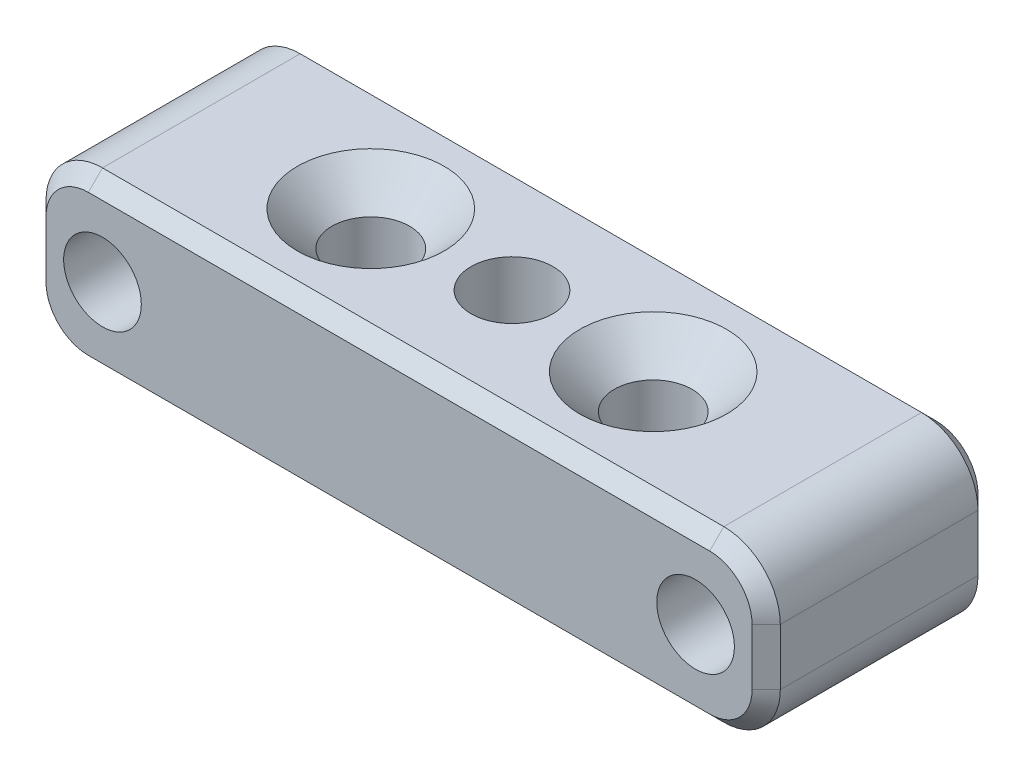
ISO-10303-21;
HEADER;
FILE_DESCRIPTION(('STEP AP214'),'2;1');
FILE_NAME('part.step','',(''),(''),'','','');
FILE_SCHEMA(('AUTOMOTIVE_DESIGN { 1 0 10303 214 1 1 1 1 }'));
ENDSEC;
DATA;
#1=APPLICATION_CONTEXT('core data for automotive mechanical design processes');
#2=APPLICATION_PROTOCOL_DEFINITION('international standard','automotive_design',2000,#1);
#3=PRODUCT_CONTEXT('',#1,'mechanical');
#4=PRODUCT('Part','Part','',(#3));
#5=PRODUCT_RELATED_PRODUCT_CATEGORY('part','',(#4));
#6=PRODUCT_DEFINITION_FORMATION('','',#4);
#7=PRODUCT_DEFINITION_CONTEXT('part definition',#1,'design');
#8=PRODUCT_DEFINITION('design','',#6,#7);
#9=PRODUCT_DEFINITION_SHAPE('','',#8);
#10=(LENGTH_UNIT() NAMED_UNIT(*) SI_UNIT(.MILLI.,.METRE.));
#11=(NAMED_UNIT(*) PLANE_ANGLE_UNIT() SI_UNIT($,.RADIAN.));
#12=(NAMED_UNIT(*) SI_UNIT($,.STERADIAN.) SOLID_ANGLE_UNIT());
#13=UNCERTAINTY_MEASURE_WITH_UNIT(LENGTH_MEASURE(1.E-05),#10,'distance_accuracy_value','');
#14=(GEOMETRIC_REPRESENTATION_CONTEXT(3) GLOBAL_UNCERTAINTY_ASSIGNED_CONTEXT((#13)) GLOBAL_UNIT_ASSIGNED_CONTEXT((#10,
#11,#12)) REPRESENTATION_CONTEXT('',''));
#15=CARTESIAN_POINT('',(0.,0.,0.));
#16=DIRECTION('',(0.,0.,1.));
#17=DIRECTION('',(1.,0.,0.));
#18=AXIS2_PLACEMENT_3D('',#15,#16,#17);
#19=CARTESIAN_POINT('',(0.,-12.,0.));
#20=DIRECTION('',(0.,-1.,0.));
#21=DIRECTION('',(0.,0.,-1.));
#22=AXIS2_PLACEMENT_3D('',#19,#20,#21);
#23=PLANE('',#22);
#24=CARTESIAN_POINT('',(-10.,-12.,24.));
#25=DIRECTION('',(0.,1.,0.));
#26=DIRECTION('',(0.,0.,1.));
#27=AXIS2_PLACEMENT_3D('',#24,#25,#26);
#28=CIRCLE('',#27,5.2);
#29=CARTESIAN_POINT('',(-10.,-12.,29.2));
#30=VERTEX_POINT('',#29);
#31=EDGE_CURVE('E455',#30,#30,#28,.T.);
#32=ORIENTED_EDGE('',*,*,#31,.F.);
#33=EDGE_LOOP('',(#32));
#34=FACE_BOUND('',#33,.T.);
#35=CARTESIAN_POINT('',(10.,-12.,24.));
#36=DIRECTION('',(0.,1.,0.));
#37=DIRECTION('',(0.,0.,1.));
#38=AXIS2_PLACEMENT_3D('',#35,#36,#37);
#39=CIRCLE('',#38,5.2);
#40=CARTESIAN_POINT('',(10.,-12.,29.2));
#41=VERTEX_POINT('',#40);
#42=EDGE_CURVE('E462',#41,#41,#39,.T.);
#43=ORIENTED_EDGE('',*,*,#42,.F.);
#44=EDGE_LOOP('',(#43));
#45=FACE_BOUND('',#44,.T.);
#46=DIRECTION('',(0.,0.,1.));
#47=VECTOR('',#46,1.);
#48=CARTESIAN_POINT('',(22.,-12.,16.));
#49=LINE('',#48,#47);
#50=CARTESIAN_POINT('',(22.,-12.,31.));
#51=VERTEX_POINT('',#50);
#52=CARTESIAN_POINT('',(22.,-12.,17.));
#53=VERTEX_POINT('',#52);
#54=EDGE_CURVE('E202',#51,#53,#49,.F.);
#55=ORIENTED_EDGE('',*,*,#54,.T.);
#56=DIRECTION('',(-1.,0.,0.));
#57=VECTOR('',#56,1.);
#58=CARTESIAN_POINT('',(-22.,-12.,17.));
#59=LINE('',#58,#57);
#60=CARTESIAN_POINT('',(-22.,-12.,17.));
#61=VERTEX_POINT('',#60);
#62=EDGE_CURVE('E253',#53,#61,#59,.T.);
#63=ORIENTED_EDGE('',*,*,#62,.T.);
#64=DIRECTION('',(0.,0.,-1.));
#65=VECTOR('',#64,1.);
#66=CARTESIAN_POINT('',(-22.,-12.,32.));
#67=LINE('',#66,#65);
#68=CARTESIAN_POINT('',(-22.,-12.,31.));
#69=VERTEX_POINT('',#68);
#70=EDGE_CURVE('E205',#61,#69,#67,.F.);
#71=ORIENTED_EDGE('',*,*,#70,.T.);
#72=DIRECTION('',(1.,0.,0.));
#73=VECTOR('',#72,1.);
#74=CARTESIAN_POINT('',(22.,-12.,31.));
#75=LINE('',#74,#73);
#76=EDGE_CURVE('E251',#69,#51,#75,.T.);
#77=ORIENTED_EDGE('',*,*,#76,.T.);
#78=EDGE_LOOP('',(#55,#63,#71,#77));
#79=FACE_BOUND('',#78,.T.);
#80=CARTESIAN_POINT('',(0.,-12.,24.));
#81=DIRECTION('',(0.,1.,0.));
#82=DIRECTION('',(0.,0.,1.));
#83=AXIS2_PLACEMENT_3D('',#80,#81,#82);
#84=CIRCLE('',#83,2.9);
#85=CARTESIAN_POINT('',(0.,-12.,26.9));
#86=VERTEX_POINT('',#85);
#87=EDGE_CURVE('E197',#86,#86,#84,.T.);
#88=ORIENTED_EDGE('',*,*,#87,.F.);
#89=EDGE_LOOP('',(#88));
#90=FACE_BOUND('',#89,.T.);
#91=ADVANCED_FACE('F43',(#34,#45,#79,#90),#23,.F.);
#92=CARTESIAN_POINT('',(0.,-24.,0.));
#93=DIRECTION('',(0.,-1.,0.));
#94=DIRECTION('',(0.,0.,-1.));
#95=AXIS2_PLACEMENT_3D('',#92,#93,#94);
#96=PLANE('',#95);
#97=CARTESIAN_POINT('',(-10.,-24.,24.));
#98=DIRECTION('',(0.,-1.,0.));
#99=DIRECTION('',(0.,0.,-1.));
#100=AXIS2_PLACEMENT_3D('',#97,#98,#99);
#101=CIRCLE('',#100,2.74999999999999);
#102=CARTESIAN_POINT('',(-10.,-24.,21.25));
#103=VERTEX_POINT('',#102);
#104=EDGE_CURVE('E461',#103,#103,#101,.T.);
#105=ORIENTED_EDGE('',*,*,#104,.F.);
#106=EDGE_LOOP('',(#105));
#107=FACE_BOUND('',#106,.T.);
#108=CARTESIAN_POINT('',(10.,-24.,24.));
#109=DIRECTION('',(0.,-1.,0.));
#110=DIRECTION('',(0.,0.,-1.));
#111=AXIS2_PLACEMENT_3D('',#108,#109,#110);
#112=CIRCLE('',#111,2.74999999999999);
#113=CARTESIAN_POINT('',(10.,-24.,21.25));
#114=VERTEX_POINT('',#113);
#115=EDGE_CURVE('E468',#114,#114,#112,.T.);
#116=ORIENTED_EDGE('',*,*,#115,.F.);
#117=EDGE_LOOP('',(#116));
#118=FACE_BOUND('',#117,.T.);
#119=DIRECTION('',(0.,0.,-1.));
#120=VECTOR('',#119,1.);
#121=CARTESIAN_POINT('',(-22.,-24.,0.));
#122=LINE('',#121,#120);
#123=CARTESIAN_POINT('',(-22.,-24.,31.));
#124=VERTEX_POINT('',#123);
#125=CARTESIAN_POINT('',(-22.,-24.,17.));
#126=VERTEX_POINT('',#125);
#127=EDGE_CURVE('E183',#124,#126,#122,.T.);
#128=ORIENTED_EDGE('',*,*,#127,.T.);
#129=DIRECTION('',(1.,0.,0.));
#130=VECTOR('',#129,1.);
#131=CARTESIAN_POINT('',(0.,-24.,17.));
#132=LINE('',#131,#130);
#133=CARTESIAN_POINT('',(22.,-24.,17.));
#134=VERTEX_POINT('',#133);
#135=EDGE_CURVE('E187',#126,#134,#132,.T.);
#136=ORIENTED_EDGE('',*,*,#135,.T.);
#137=DIRECTION('',(0.,0.,1.));
#138=VECTOR('',#137,1.);
#139=CARTESIAN_POINT('',(22.,-24.,0.));
#140=LINE('',#139,#138);
#141=CARTESIAN_POINT('',(22.,-24.,31.));
#142=VERTEX_POINT('',#141);
#143=EDGE_CURVE('E186',#134,#142,#140,.T.);
#144=ORIENTED_EDGE('',*,*,#143,.T.);
#145=DIRECTION('',(-1.,0.,0.));
#146=VECTOR('',#145,1.);
#147=CARTESIAN_POINT('',(0.,-24.,31.));
#148=LINE('',#147,#146);
#149=EDGE_CURVE('E162',#142,#124,#148,.T.);
#150=ORIENTED_EDGE('',*,*,#149,.T.);
#151=EDGE_LOOP('',(#128,#136,#144,#150));
#152=FACE_BOUND('',#151,.T.);
#153=CARTESIAN_POINT('',(0.,-24.,24.));
#154=DIRECTION('',(0.,1.,0.));
#155=DIRECTION('',(0.,0.,1.));
#156=AXIS2_PLACEMENT_3D('',#153,#154,#155);
#157=CIRCLE('',#156,2.9);
#158=CARTESIAN_POINT('',(0.,-24.,26.9));
#159=VERTEX_POINT('',#158);
#160=EDGE_CURVE('E471',#159,#159,#157,.T.);
#161=ORIENTED_EDGE('',*,*,#160,.T.);
#162=EDGE_LOOP('',(#161));
#163=FACE_BOUND('',#162,.T.);
#164=ADVANCED_FACE('F180',(#107,#118,#152,#163),#96,.T.);
#165=CARTESIAN_POINT('',(-26.,-12.,16.));
#166=DIRECTION('',(0.,0.,-1.));
#167=DIRECTION('',(-1.,0.,0.));
#168=AXIS2_PLACEMENT_3D('',#165,#166,#167);
#169=PLANE('',#168);
#170=CARTESIAN_POINT('',(22.,-20.,16.));
#171=DIRECTION('',(0.,0.,-1.));
#172=DIRECTION('',(-1.,0.,0.));
#173=AXIS2_PLACEMENT_3D('',#170,#171,#172);
#174=CIRCLE('',#173,3.00000000000001);
#175=CARTESIAN_POINT('',(25.,-20.,16.));
#176=VERTEX_POINT('',#175);
#177=CARTESIAN_POINT('',(22.,-23.,16.));
#178=VERTEX_POINT('',#177);
#179=EDGE_CURVE('E224',#176,#178,#174,.T.);
#180=ORIENTED_EDGE('',*,*,#179,.T.);
#181=DIRECTION('',(-1.,0.,0.));
#182=VECTOR('',#181,1.);
#183=CARTESIAN_POINT('',(-26.,-23.,16.));
#184=LINE('',#183,#182);
#185=CARTESIAN_POINT('',(-22.,-23.,16.));
#186=VERTEX_POINT('',#185);
#187=EDGE_CURVE('E175',#178,#186,#184,.T.);
#188=ORIENTED_EDGE('',*,*,#187,.T.);
#189=CARTESIAN_POINT('',(-22.,-20.,16.));
#190=DIRECTION('',(0.,0.,-1.));
#191=DIRECTION('',(-1.,0.,0.));
#192=AXIS2_PLACEMENT_3D('',#189,#190,#191);
#193=CIRCLE('',#192,3.00000000000001);
#194=CARTESIAN_POINT('',(-25.,-20.,16.));
#195=VERTEX_POINT('',#194);
#196=EDGE_CURVE('E226',#186,#195,#193,.T.);
#197=ORIENTED_EDGE('',*,*,#196,.T.);
#198=DIRECTION('',(0.,1.,0.));
#199=VECTOR('',#198,1.);
#200=CARTESIAN_POINT('',(-25.,-12.,16.));
#201=LINE('',#200,#199);
#202=CARTESIAN_POINT('',(-25.,-16.,16.));
#203=VERTEX_POINT('',#202);
#204=EDGE_CURVE('E222',#195,#203,#201,.T.);
#205=ORIENTED_EDGE('',*,*,#204,.T.);
#206=CARTESIAN_POINT('',(-22.,-16.,16.));
#207=DIRECTION('',(0.,0.,-1.));
#208=DIRECTION('',(-1.,0.,0.));
#209=AXIS2_PLACEMENT_3D('',#206,#207,#208);
#210=CIRCLE('',#209,3.00000000000001);
#211=CARTESIAN_POINT('',(-22.,-13.,16.));
#212=VERTEX_POINT('',#211);
#213=EDGE_CURVE('E218',#203,#212,#210,.T.);
#214=ORIENTED_EDGE('',*,*,#213,.T.);
#215=DIRECTION('',(1.,0.,0.));
#216=VECTOR('',#215,1.);
#217=CARTESIAN_POINT('',(22.,-13.,16.));
#218=LINE('',#217,#216);
#219=CARTESIAN_POINT('',(22.,-13.,16.));
#220=VERTEX_POINT('',#219);
#221=EDGE_CURVE('E214',#212,#220,#218,.T.);
#222=ORIENTED_EDGE('',*,*,#221,.T.);
#223=CARTESIAN_POINT('',(22.,-16.,16.));
#224=DIRECTION('',(0.,0.,-1.));
#225=DIRECTION('',(-1.,0.,0.));
#226=AXIS2_PLACEMENT_3D('',#223,#224,#225);
#227=CIRCLE('',#226,3.00000000000001);
#228=CARTESIAN_POINT('',(25.,-16.,16.));
#229=VERTEX_POINT('',#228);
#230=EDGE_CURVE('E216',#220,#229,#227,.T.);
#231=ORIENTED_EDGE('',*,*,#230,.T.);
#232=DIRECTION('',(0.,-1.,0.));
#233=VECTOR('',#232,1.);
#234=CARTESIAN_POINT('',(25.,-12.,16.));
#235=LINE('',#234,#233);
#236=EDGE_CURVE('E220',#229,#176,#235,.T.);
#237=ORIENTED_EDGE('',*,*,#236,.T.);
#238=EDGE_LOOP('',(#180,#188,#197,#205,#214,#222,#231,#237));
#239=FACE_BOUND('',#238,.T.);
#240=CARTESIAN_POINT('',(21.,-18.,16.));
#241=DIRECTION('',(0.,0.,-1.));
#242=DIRECTION('',(-1.,0.,0.));
#243=AXIS2_PLACEMENT_3D('',#240,#241,#242);
#244=CIRCLE('',#243,2.74999999999996);
#245=CARTESIAN_POINT('',(18.25,-18.,16.));
#246=VERTEX_POINT('',#245);
#247=EDGE_CURVE('E443',#246,#246,#244,.T.);
#248=ORIENTED_EDGE('',*,*,#247,.F.);
#249=EDGE_LOOP('',(#248));
#250=FACE_BOUND('',#249,.T.);
#251=CARTESIAN_POINT('',(-21.,-18.,16.));
#252=DIRECTION('',(0.,0.,-1.));
#253=DIRECTION('',(-1.,0.,0.));
#254=AXIS2_PLACEMENT_3D('',#251,#252,#253);
#255=CIRCLE('',#254,2.74999999999996);
#256=CARTESIAN_POINT('',(-23.75,-18.,16.));
#257=VERTEX_POINT('',#256);
#258=EDGE_CURVE('E452',#257,#257,#255,.T.);
#259=ORIENTED_EDGE('',*,*,#258,.F.);
#260=EDGE_LOOP('',(#259));
#261=FACE_BOUND('',#260,.T.);
#262=ADVANCED_FACE('F346',(#239,#250,#261),#169,.T.);
#263=CARTESIAN_POINT('',(-26.,-12.,32.));
#264=DIRECTION('',(-1.,0.,0.));
#265=DIRECTION('',(0.,0.,1.));
#266=AXIS2_PLACEMENT_3D('',#263,#264,#265);
#267=PLANE('',#266);
#268=DIRECTION('',(0.,0.,-1.));
#269=VECTOR('',#268,1.);
#270=CARTESIAN_POINT('',(-26.,-16.,16.));
#271=LINE('',#270,#269);
#272=CARTESIAN_POINT('',(-26.,-16.,31.));
#273=VERTEX_POINT('',#272);
#274=CARTESIAN_POINT('',(-26.,-16.,17.));
#275=VERTEX_POINT('',#274);
#276=EDGE_CURVE('E192',#273,#275,#271,.T.);
#277=ORIENTED_EDGE('',*,*,#276,.T.);
#278=DIRECTION('',(0.,-1.,0.));
#279=VECTOR('',#278,1.);
#280=CARTESIAN_POINT('',(-26.,-12.,17.));
#281=LINE('',#280,#279);
#282=CARTESIAN_POINT('',(-26.,-20.,17.));
#283=VERTEX_POINT('',#282);
#284=EDGE_CURVE('E237',#275,#283,#281,.T.);
#285=ORIENTED_EDGE('',*,*,#284,.T.);
#286=DIRECTION('',(0.,0.,-1.));
#287=VECTOR('',#286,1.);
#288=CARTESIAN_POINT('',(-26.,-20.,32.));
#289=LINE('',#288,#287);
#290=CARTESIAN_POINT('',(-26.,-20.,31.));
#291=VERTEX_POINT('',#290);
#292=EDGE_CURVE('E195',#283,#291,#289,.F.);
#293=ORIENTED_EDGE('',*,*,#292,.T.);
#294=DIRECTION('',(0.,1.,0.));
#295=VECTOR('',#294,1.);
#296=CARTESIAN_POINT('',(-26.,-12.,31.));
#297=LINE('',#296,#295);
#298=EDGE_CURVE('E235',#291,#273,#297,.T.);
#299=ORIENTED_EDGE('',*,*,#298,.T.);
#300=EDGE_LOOP('',(#277,#285,#293,#299));
#301=FACE_BOUND('',#300,.T.);
#302=ADVANCED_FACE('F389',(#301),#267,.T.);
#303=CARTESIAN_POINT('',(26.,-12.,32.));
#304=DIRECTION('',(0.,0.,1.));
#305=DIRECTION('',(1.,0.,0.));
#306=AXIS2_PLACEMENT_3D('',#303,#304,#305);
#307=PLANE('',#306);
#308=CARTESIAN_POINT('',(-22.,-20.,32.));
#309=DIRECTION('',(0.,0.,1.));
#310=DIRECTION('',(1.,0.,0.));
#311=AXIS2_PLACEMENT_3D('',#308,#309,#310);
#312=CIRCLE('',#311,3.00000000000001);
#313=CARTESIAN_POINT('',(-25.,-20.,32.));
#314=VERTEX_POINT('',#313);
#315=CARTESIAN_POINT('',(-22.,-23.,32.));
#316=VERTEX_POINT('',#315);
#317=EDGE_CURVE('E68',#314,#316,#312,.T.);
#318=ORIENTED_EDGE('',*,*,#317,.T.);
#319=DIRECTION('',(1.,0.,0.));
#320=VECTOR('',#319,1.);
#321=CARTESIAN_POINT('',(26.,-23.,32.));
#322=LINE('',#321,#320);
#323=CARTESIAN_POINT('',(22.,-23.,32.));
#324=VERTEX_POINT('',#323);
#325=EDGE_CURVE('E11',#316,#324,#322,.T.);
#326=ORIENTED_EDGE('',*,*,#325,.T.);
#327=CARTESIAN_POINT('',(22.,-20.,32.));
#328=DIRECTION('',(0.,0.,1.));
#329=DIRECTION('',(1.,0.,0.));
#330=AXIS2_PLACEMENT_3D('',#327,#328,#329);
#331=CIRCLE('',#330,3.00000000000001);
#332=CARTESIAN_POINT('',(25.,-20.,32.));
#333=VERTEX_POINT('',#332);
#334=EDGE_CURVE('E53',#324,#333,#331,.T.);
#335=ORIENTED_EDGE('',*,*,#334,.T.);
#336=DIRECTION('',(0.,1.,0.));
#337=VECTOR('',#336,1.);
#338=CARTESIAN_POINT('',(25.,-12.,32.));
#339=LINE('',#338,#337);
#340=CARTESIAN_POINT('',(25.,-16.,32.));
#341=VERTEX_POINT('',#340);
#342=EDGE_CURVE('E263',#333,#341,#339,.T.);
#343=ORIENTED_EDGE('',*,*,#342,.T.);
#344=CARTESIAN_POINT('',(22.,-16.,32.));
#345=DIRECTION('',(0.,0.,1.));
#346=DIRECTION('',(1.,0.,0.));
#347=AXIS2_PLACEMENT_3D('',#344,#345,#346);
#348=CIRCLE('',#347,3.00000000000001);
#349=CARTESIAN_POINT('',(22.,-13.,32.));
#350=VERTEX_POINT('',#349);
#351=EDGE_CURVE('E259',#341,#350,#348,.T.);
#352=ORIENTED_EDGE('',*,*,#351,.T.);
#353=DIRECTION('',(-1.,0.,0.));
#354=VECTOR('',#353,1.);
#355=CARTESIAN_POINT('',(-22.,-13.,32.));
#356=LINE('',#355,#354);
#357=CARTESIAN_POINT('',(-22.,-13.,32.));
#358=VERTEX_POINT('',#357);
#359=EDGE_CURVE('E255',#350,#358,#356,.T.);
#360=ORIENTED_EDGE('',*,*,#359,.T.);
#361=CARTESIAN_POINT('',(-22.,-16.,32.));
#362=DIRECTION('',(0.,0.,1.));
#363=DIRECTION('',(1.,0.,0.));
#364=AXIS2_PLACEMENT_3D('',#361,#362,#363);
#365=CIRCLE('',#364,3.00000000000001);
#366=CARTESIAN_POINT('',(-25.,-16.,32.));
#367=VERTEX_POINT('',#366);
#368=EDGE_CURVE('E257',#358,#367,#365,.T.);
#369=ORIENTED_EDGE('',*,*,#368,.T.);
#370=DIRECTION('',(0.,-1.,0.));
#371=VECTOR('',#370,1.);
#372=CARTESIAN_POINT('',(-25.,-12.,32.));
#373=LINE('',#372,#371);
#374=EDGE_CURVE('E261',#367,#314,#373,.T.);
#375=ORIENTED_EDGE('',*,*,#374,.T.);
#376=EDGE_LOOP('',(#318,#326,#335,#343,#352,#360,#369,#375));
#377=FACE_BOUND('',#376,.T.);
#378=CARTESIAN_POINT('',(21.,-18.,32.));
#379=DIRECTION('',(0.,0.,1.));
#380=DIRECTION('',(1.,0.,0.));
#381=AXIS2_PLACEMENT_3D('',#378,#379,#380);
#382=CIRCLE('',#381,2.75);
#383=CARTESIAN_POINT('',(23.75,-18.,32.));
#384=VERTEX_POINT('',#383);
#385=EDGE_CURVE('E288',#384,#384,#382,.T.);
#386=ORIENTED_EDGE('',*,*,#385,.F.);
#387=EDGE_LOOP('',(#386));
#388=FACE_BOUND('',#387,.T.);
#389=CARTESIAN_POINT('',(-21.,-18.,32.));
#390=DIRECTION('',(0.,0.,1.));
#391=DIRECTION('',(1.,0.,0.));
#392=AXIS2_PLACEMENT_3D('',#389,#390,#391);
#393=CIRCLE('',#392,2.75);
#394=CARTESIAN_POINT('',(-18.25,-18.,32.));
#395=VERTEX_POINT('',#394);
#396=EDGE_CURVE('E447',#395,#395,#393,.T.);
#397=ORIENTED_EDGE('',*,*,#396,.F.);
#398=EDGE_LOOP('',(#397));
#399=FACE_BOUND('',#398,.T.);
#400=ADVANCED_FACE('F316',(#377,#388,#399),#307,.T.);
#401=CARTESIAN_POINT('',(26.,-12.,16.));
#402=DIRECTION('',(1.,0.,0.));
#403=DIRECTION('',(0.,0.,-1.));
#404=AXIS2_PLACEMENT_3D('',#401,#402,#403);
#405=PLANE('',#404);
#406=DIRECTION('',(0.,0.,1.));
#407=VECTOR('',#406,1.);
#408=CARTESIAN_POINT('',(26.,-20.,16.));
#409=LINE('',#408,#407);
#410=CARTESIAN_POINT('',(26.,-20.,31.));
#411=VERTEX_POINT('',#410);
#412=CARTESIAN_POINT('',(26.,-20.,17.));
#413=VERTEX_POINT('',#412);
#414=EDGE_CURVE('E188',#411,#413,#409,.F.);
#415=ORIENTED_EDGE('',*,*,#414,.T.);
#416=DIRECTION('',(0.,1.,0.));
#417=VECTOR('',#416,1.);
#418=CARTESIAN_POINT('',(26.,-12.,17.));
#419=LINE('',#418,#417);
#420=CARTESIAN_POINT('',(26.,-16.,17.));
#421=VERTEX_POINT('',#420);
#422=EDGE_CURVE('E241',#413,#421,#419,.T.);
#423=ORIENTED_EDGE('',*,*,#422,.T.);
#424=DIRECTION('',(0.,0.,1.));
#425=VECTOR('',#424,1.);
#426=CARTESIAN_POINT('',(26.,-16.,32.));
#427=LINE('',#426,#425);
#428=CARTESIAN_POINT('',(26.,-16.,31.));
#429=VERTEX_POINT('',#428);
#430=EDGE_CURVE('E208',#421,#429,#427,.T.);
#431=ORIENTED_EDGE('',*,*,#430,.T.);
#432=DIRECTION('',(0.,-1.,0.));
#433=VECTOR('',#432,1.);
#434=CARTESIAN_POINT('',(26.,-12.,31.));
#435=LINE('',#434,#433);
#436=EDGE_CURVE('E239',#429,#411,#435,.T.);
#437=ORIENTED_EDGE('',*,*,#436,.T.);
#438=EDGE_LOOP('',(#415,#423,#431,#437));
#439=FACE_BOUND('',#438,.T.);
#440=ADVANCED_FACE('F333',(#439),#405,.T.);
#441=CARTESIAN_POINT('',(0.,-12.,24.));
#442=DIRECTION('',(0.,-1.,0.));
#443=DIRECTION('',(0.,0.,-1.));
#444=AXIS2_PLACEMENT_3D('',#441,#442,#443);
#445=CYLINDRICAL_SURFACE('',#444,2.9);
#446=ORIENTED_EDGE('',*,*,#87,.T.);
#447=EDGE_LOOP('',(#446));
#448=FACE_BOUND('',#447,.T.);
#449=ORIENTED_EDGE('',*,*,#160,.F.);
#450=EDGE_LOOP('',(#449));
#451=FACE_BOUND('',#450,.T.);
#452=ADVANCED_FACE('F409',(#448,#451),#445,.F.);
#453=CARTESIAN_POINT('',(10.,-12.,24.));
#454=DIRECTION('',(0.,1.,0.));
#455=DIRECTION('',(0.,0.,1.));
#456=AXIS2_PLACEMENT_3D('',#453,#454,#455);
#457=CYLINDRICAL_SURFACE('',#456,2.74999999999999);
#458=ORIENTED_EDGE('',*,*,#115,.T.);
#459=EDGE_LOOP('',(#458));
#460=FACE_BOUND('',#459,.T.);
#461=CARTESIAN_POINT('',(10.,-14.45,24.));
#462=DIRECTION('',(0.,1.,0.));
#463=DIRECTION('',(0.,0.,1.));
#464=AXIS2_PLACEMENT_3D('',#461,#462,#463);
#465=CIRCLE('',#464,2.75);
#466=CARTESIAN_POINT('',(10.,-14.45,26.75));
#467=VERTEX_POINT('',#466);
#468=EDGE_CURVE('E465',#467,#467,#465,.T.);
#469=ORIENTED_EDGE('',*,*,#468,.T.);
#470=EDGE_LOOP('',(#469));
#471=FACE_BOUND('',#470,.T.);
#472=ADVANCED_FACE('F412',(#460,#471),#457,.F.);
#473=CARTESIAN_POINT('',(10.,-12.,24.));
#474=DIRECTION('',(0.,1.,0.));
#475=DIRECTION('',(0.,0.,1.));
#476=AXIS2_PLACEMENT_3D('',#473,#474,#475);
#477=CONICAL_SURFACE('',#476,5.2,0.785398163397449);
#478=ORIENTED_EDGE('',*,*,#468,.F.);
#479=EDGE_LOOP('',(#478));
#480=FACE_BOUND('',#479,.T.);
#481=ORIENTED_EDGE('',*,*,#42,.T.);
#482=EDGE_LOOP('',(#481));
#483=FACE_BOUND('',#482,.T.);
#484=ADVANCED_FACE('F416',(#480,#483),#477,.F.);
#485=CARTESIAN_POINT('',(-10.,-12.,24.));
#486=DIRECTION('',(0.,1.,0.));
#487=DIRECTION('',(0.,0.,1.));
#488=AXIS2_PLACEMENT_3D('',#485,#486,#487);
#489=CYLINDRICAL_SURFACE('',#488,2.74999999999999);
#490=ORIENTED_EDGE('',*,*,#104,.T.);
#491=EDGE_LOOP('',(#490));
#492=FACE_BOUND('',#491,.T.);
#493=CARTESIAN_POINT('',(-10.,-14.45,24.));
#494=DIRECTION('',(0.,1.,0.));
#495=DIRECTION('',(0.,0.,1.));
#496=AXIS2_PLACEMENT_3D('',#493,#494,#495);
#497=CIRCLE('',#496,2.75);
#498=CARTESIAN_POINT('',(-10.,-14.45,26.75));
#499=VERTEX_POINT('',#498);
#500=EDGE_CURVE('E458',#499,#499,#497,.T.);
#501=ORIENTED_EDGE('',*,*,#500,.T.);
#502=EDGE_LOOP('',(#501));
#503=FACE_BOUND('',#502,.T.);
#504=ADVANCED_FACE('F420',(#492,#503),#489,.F.);
#505=CARTESIAN_POINT('',(-10.,-12.,24.));
#506=DIRECTION('',(0.,1.,0.));
#507=DIRECTION('',(0.,0.,1.));
#508=AXIS2_PLACEMENT_3D('',#505,#506,#507);
#509=CONICAL_SURFACE('',#508,5.2,0.785398163397449);
#510=ORIENTED_EDGE('',*,*,#500,.F.);
#511=EDGE_LOOP('',(#510));
#512=FACE_BOUND('',#511,.T.);
#513=ORIENTED_EDGE('',*,*,#31,.T.);
#514=EDGE_LOOP('',(#513));
#515=FACE_BOUND('',#514,.T.);
#516=ADVANCED_FACE('F424',(#512,#515),#509,.F.);
#517=CARTESIAN_POINT('',(-21.,-18.,32.));
#518=DIRECTION('',(0.,0.,1.));
#519=DIRECTION('',(1.,0.,0.));
#520=AXIS2_PLACEMENT_3D('',#517,#518,#519);
#521=CYLINDRICAL_SURFACE('',#520,2.74999999999996);
#522=ORIENTED_EDGE('',*,*,#258,.T.);
#523=EDGE_LOOP('',(#522));
#524=FACE_BOUND('',#523,.T.);
#525=ORIENTED_EDGE('',*,*,#396,.T.);
#526=EDGE_LOOP('',(#525));
#527=FACE_BOUND('',#526,.T.);
#528=ADVANCED_FACE('F428',(#524,#527),#521,.F.);
#529=CARTESIAN_POINT('',(21.,-18.,32.));
#530=DIRECTION('',(0.,0.,1.));
#531=DIRECTION('',(1.,0.,0.));
#532=AXIS2_PLACEMENT_3D('',#529,#530,#531);
#533=CYLINDRICAL_SURFACE('',#532,2.74999999999996);
#534=ORIENTED_EDGE('',*,*,#247,.T.);
#535=EDGE_LOOP('',(#534));
#536=FACE_BOUND('',#535,.T.);
#537=ORIENTED_EDGE('',*,*,#385,.T.);
#538=EDGE_LOOP('',(#537));
#539=FACE_BOUND('',#538,.T.);
#540=ADVANCED_FACE('F432',(#536,#539),#533,.F.);
#541=CARTESIAN_POINT('',(-22.,-20.,0.));
#542=DIRECTION('',(0.,0.,-1.));
#543=DIRECTION('',(-1.,0.,0.));
#544=AXIS2_PLACEMENT_3D('',#541,#542,#543);
#545=CYLINDRICAL_SURFACE('',#544,4.);
#546=ORIENTED_EDGE('',*,*,#292,.F.);
#547=CARTESIAN_POINT('',(-22.,-20.,17.));
#548=DIRECTION('',(0.,0.,-1.));
#549=DIRECTION('',(-1.,0.,0.));
#550=AXIS2_PLACEMENT_3D('',#547,#548,#549);
#551=CIRCLE('',#550,4.);
#552=EDGE_CURVE('E174',#283,#126,#551,.F.);
#553=ORIENTED_EDGE('',*,*,#552,.T.);
#554=ORIENTED_EDGE('',*,*,#127,.F.);
#555=CARTESIAN_POINT('',(-22.,-20.,31.));
#556=DIRECTION('',(0.,0.,1.));
#557=DIRECTION('',(1.,0.,0.));
#558=AXIS2_PLACEMENT_3D('',#555,#556,#557);
#559=CIRCLE('',#558,4.);
#560=EDGE_CURVE('E166',#124,#291,#559,.F.);
#561=ORIENTED_EDGE('',*,*,#560,.T.);
#562=EDGE_LOOP('',(#546,#553,#554,#561));
#563=FACE_BOUND('',#562,.T.);
#564=ADVANCED_FACE('F190',(#563),#545,.T.);
#565=CARTESIAN_POINT('',(-22.,-16.,32.));
#566=DIRECTION('',(0.,0.,1.));
#567=DIRECTION('',(1.,0.,0.));
#568=AXIS2_PLACEMENT_3D('',#565,#566,#567);
#569=CYLINDRICAL_SURFACE('',#568,4.);
#570=ORIENTED_EDGE('',*,*,#70,.F.);
#571=CARTESIAN_POINT('',(-22.,-16.,17.));
#572=DIRECTION('',(0.,0.,-1.));
#573=DIRECTION('',(-1.,0.,0.));
#574=AXIS2_PLACEMENT_3D('',#571,#572,#573);
#575=CIRCLE('',#574,4.);
#576=EDGE_CURVE('E245',#61,#275,#575,.F.);
#577=ORIENTED_EDGE('',*,*,#576,.T.);
#578=ORIENTED_EDGE('',*,*,#276,.F.);
#579=CARTESIAN_POINT('',(-22.,-16.,31.));
#580=DIRECTION('',(0.,0.,1.));
#581=DIRECTION('',(1.,0.,0.));
#582=AXIS2_PLACEMENT_3D('',#579,#580,#581);
#583=CIRCLE('',#582,4.);
#584=EDGE_CURVE('E243',#273,#69,#583,.F.);
#585=ORIENTED_EDGE('',*,*,#584,.T.);
#586=EDGE_LOOP('',(#570,#577,#578,#585));
#587=FACE_BOUND('',#586,.T.);
#588=ADVANCED_FACE('F381',(#587),#569,.T.);
#589=CARTESIAN_POINT('',(22.,-20.,0.));
#590=DIRECTION('',(0.,0.,1.));
#591=DIRECTION('',(1.,0.,0.));
#592=AXIS2_PLACEMENT_3D('',#589,#590,#591);
#593=CYLINDRICAL_SURFACE('',#592,4.);
#594=ORIENTED_EDGE('',*,*,#143,.F.);
#595=CARTESIAN_POINT('',(22.,-20.,17.));
#596=DIRECTION('',(0.,0.,-1.));
#597=DIRECTION('',(-1.,0.,0.));
#598=AXIS2_PLACEMENT_3D('',#595,#596,#597);
#599=CIRCLE('',#598,4.);
#600=EDGE_CURVE('E233',#134,#413,#599,.F.);
#601=ORIENTED_EDGE('',*,*,#600,.T.);
#602=ORIENTED_EDGE('',*,*,#414,.F.);
#603=CARTESIAN_POINT('',(22.,-20.,31.));
#604=DIRECTION('',(0.,0.,1.));
#605=DIRECTION('',(1.,0.,0.));
#606=AXIS2_PLACEMENT_3D('',#603,#604,#605);
#607=CIRCLE('',#606,4.);
#608=EDGE_CURVE('E231',#411,#142,#607,.F.);
#609=ORIENTED_EDGE('',*,*,#608,.T.);
#610=EDGE_LOOP('',(#594,#601,#602,#609));
#611=FACE_BOUND('',#610,.T.);
#612=ADVANCED_FACE('F329',(#611),#593,.T.);
#613=CARTESIAN_POINT('',(22.,-16.,16.));
#614=DIRECTION('',(0.,0.,-1.));
#615=DIRECTION('',(-1.,0.,0.));
#616=AXIS2_PLACEMENT_3D('',#613,#614,#615);
#617=CYLINDRICAL_SURFACE('',#616,4.);
#618=ORIENTED_EDGE('',*,*,#430,.F.);
#619=CARTESIAN_POINT('',(22.,-16.,17.));
#620=DIRECTION('',(0.,0.,-1.));
#621=DIRECTION('',(-1.,0.,0.));
#622=AXIS2_PLACEMENT_3D('',#619,#620,#621);
#623=CIRCLE('',#622,4.);
#624=EDGE_CURVE('E249',#421,#53,#623,.F.);
#625=ORIENTED_EDGE('',*,*,#624,.T.);
#626=ORIENTED_EDGE('',*,*,#54,.F.);
#627=CARTESIAN_POINT('',(22.,-16.,31.));
#628=DIRECTION('',(0.,0.,1.));
#629=DIRECTION('',(1.,0.,0.));
#630=AXIS2_PLACEMENT_3D('',#627,#628,#629);
#631=CIRCLE('',#630,4.);
#632=EDGE_CURVE('E247',#51,#429,#631,.F.);
#633=ORIENTED_EDGE('',*,*,#632,.T.);
#634=EDGE_LOOP('',(#618,#625,#626,#633));
#635=FACE_BOUND('',#634,.T.);
#636=ADVANCED_FACE('F376',(#635),#617,.T.);
#637=CARTESIAN_POINT('',(-26.,-13.,16.));
#638=DIRECTION('',(0.,0.707106781186547,-0.707106781186547));
#639=DIRECTION('',(-1.,0.,0.));
#640=AXIS2_PLACEMENT_3D('',#637,#638,#639);
#641=PLANE('',#640);
#642=DIRECTION('',(0.,0.707106781186547,0.707106781186547));
#643=VECTOR('',#642,1.);
#644=CARTESIAN_POINT('',(22.,-13.,16.));
#645=LINE('',#644,#643);
#646=EDGE_CURVE('E283',#220,#53,#645,.T.);
#647=ORIENTED_EDGE('',*,*,#646,.F.);
#648=ORIENTED_EDGE('',*,*,#221,.F.);
#649=DIRECTION('',(0.,-0.707106781186547,-0.707106781186547));
#650=VECTOR('',#649,1.);
#651=CARTESIAN_POINT('',(-22.,-12.,17.));
#652=LINE('',#651,#650);
#653=EDGE_CURVE('E286',#61,#212,#652,.T.);
#654=ORIENTED_EDGE('',*,*,#653,.F.);
#655=ORIENTED_EDGE('',*,*,#62,.F.);
#656=EDGE_LOOP('',(#647,#648,#654,#655));
#657=FACE_BOUND('',#656,.T.);
#658=ADVANCED_FACE('F368',(#657),#641,.T.);
#659=CARTESIAN_POINT('',(-22.,-16.,16.));
#660=DIRECTION('',(0.,0.,1.));
#661=DIRECTION('',(1.,0.,0.));
#662=AXIS2_PLACEMENT_3D('',#659,#660,#661);
#663=CONICAL_SURFACE('',#662,3.00000000000001,0.785398163397448);
#664=ORIENTED_EDGE('',*,*,#653,.T.);
#665=ORIENTED_EDGE('',*,*,#213,.F.);
#666=DIRECTION('',(0.707106781186547,0.,-0.707106781186547));
#667=VECTOR('',#666,1.);
#668=CARTESIAN_POINT('',(-26.,-16.,17.));
#669=LINE('',#668,#667);
#670=EDGE_CURVE('E280',#275,#203,#669,.T.);
#671=ORIENTED_EDGE('',*,*,#670,.F.);
#672=ORIENTED_EDGE('',*,*,#576,.F.);
#673=EDGE_LOOP('',(#664,#665,#671,#672));
#674=FACE_BOUND('',#673,.T.);
#675=ADVANCED_FACE('F363',(#674),#663,.T.);
#676=CARTESIAN_POINT('',(22.,-16.,16.));
#677=DIRECTION('',(0.,0.,1.));
#678=DIRECTION('',(1.,0.,0.));
#679=AXIS2_PLACEMENT_3D('',#676,#677,#678);
#680=CONICAL_SURFACE('',#679,3.00000000000001,0.785398163397448);
#681=ORIENTED_EDGE('',*,*,#646,.T.);
#682=ORIENTED_EDGE('',*,*,#624,.F.);
#683=DIRECTION('',(0.707106781186547,0.,0.707106781186547));
#684=VECTOR('',#683,1.);
#685=CARTESIAN_POINT('',(25.,-16.,16.));
#686=LINE('',#685,#684);
#687=EDGE_CURVE('E277',#229,#421,#686,.T.);
#688=ORIENTED_EDGE('',*,*,#687,.F.);
#689=ORIENTED_EDGE('',*,*,#230,.F.);
#690=EDGE_LOOP('',(#681,#682,#688,#689));
#691=FACE_BOUND('',#690,.T.);
#692=ADVANCED_FACE('F373',(#691),#680,.T.);
#693=CARTESIAN_POINT('',(-26.,-12.,17.));
#694=DIRECTION('',(0.707106781186547,0.,0.707106781186547));
#695=DIRECTION('',(0.,-1.,0.));
#696=AXIS2_PLACEMENT_3D('',#693,#694,#695);
#697=PLANE('',#696);
#698=ORIENTED_EDGE('',*,*,#670,.T.);
#699=ORIENTED_EDGE('',*,*,#204,.F.);
#700=DIRECTION('',(0.707106781186547,0.,-0.707106781186547));
#701=VECTOR('',#700,1.);
#702=CARTESIAN_POINT('',(-26.,-20.,17.));
#703=LINE('',#702,#701);
#704=EDGE_CURVE('E274',#283,#195,#703,.T.);
#705=ORIENTED_EDGE('',*,*,#704,.F.);
#706=ORIENTED_EDGE('',*,*,#284,.F.);
#707=EDGE_LOOP('',(#698,#699,#705,#706));
#708=FACE_BOUND('',#707,.T.);
#709=ADVANCED_FACE('F358',(#708),#697,.F.);
#710=CARTESIAN_POINT('',(25.,-12.,16.));
#711=DIRECTION('',(-0.707106781186547,0.,0.707106781186547));
#712=DIRECTION('',(0.,-1.,0.));
#713=AXIS2_PLACEMENT_3D('',#710,#711,#712);
#714=PLANE('',#713);
#715=ORIENTED_EDGE('',*,*,#687,.T.);
#716=ORIENTED_EDGE('',*,*,#422,.F.);
#717=DIRECTION('',(0.707106781186547,0.,0.707106781186547));
#718=VECTOR('',#717,1.);
#719=CARTESIAN_POINT('',(25.,-20.,16.));
#720=LINE('',#719,#718);
#721=EDGE_CURVE('E271',#176,#413,#720,.T.);
#722=ORIENTED_EDGE('',*,*,#721,.F.);
#723=ORIENTED_EDGE('',*,*,#236,.F.);
#724=EDGE_LOOP('',(#715,#716,#722,#723));
#725=FACE_BOUND('',#724,.T.);
#726=ADVANCED_FACE('F337',(#725),#714,.F.);
#727=CARTESIAN_POINT('',(-22.,-20.,16.));
#728=DIRECTION('',(0.,0.,1.));
#729=DIRECTION('',(1.,0.,0.));
#730=AXIS2_PLACEMENT_3D('',#727,#728,#729);
#731=CONICAL_SURFACE('',#730,3.00000000000001,0.785398163397448);
#732=ORIENTED_EDGE('',*,*,#704,.T.);
#733=ORIENTED_EDGE('',*,*,#196,.F.);
#734=DIRECTION('',(0.,0.707106781186547,-0.707106781186547));
#735=VECTOR('',#734,1.);
#736=CARTESIAN_POINT('',(-22.,-24.,17.));
#737=LINE('',#736,#735);
#738=EDGE_CURVE('E269',#126,#186,#737,.T.);
#739=ORIENTED_EDGE('',*,*,#738,.F.);
#740=ORIENTED_EDGE('',*,*,#552,.F.);
#741=EDGE_LOOP('',(#732,#733,#739,#740));
#742=FACE_BOUND('',#741,.T.);
#743=ADVANCED_FACE('F353',(#742),#731,.T.);
#744=CARTESIAN_POINT('',(22.,-20.,16.));
#745=DIRECTION('',(0.,0.,1.));
#746=DIRECTION('',(1.,0.,0.));
#747=AXIS2_PLACEMENT_3D('',#744,#745,#746);
#748=CONICAL_SURFACE('',#747,3.00000000000001,0.785398163397448);
#749=ORIENTED_EDGE('',*,*,#721,.T.);
#750=ORIENTED_EDGE('',*,*,#600,.F.);
#751=DIRECTION('',(0.,-0.707106781186547,0.707106781186547));
#752=VECTOR('',#751,1.);
#753=CARTESIAN_POINT('',(22.,-23.,16.));
#754=LINE('',#753,#752);
#755=EDGE_CURVE('E267',#178,#134,#754,.T.);
#756=ORIENTED_EDGE('',*,*,#755,.F.);
#757=ORIENTED_EDGE('',*,*,#179,.F.);
#758=EDGE_LOOP('',(#749,#750,#756,#757));
#759=FACE_BOUND('',#758,.T.);
#760=ADVANCED_FACE('F342',(#759),#748,.T.);
#761=CARTESIAN_POINT('',(0.,-24.,17.));
#762=DIRECTION('',(0.,0.707106781186547,0.707106781186547));
#763=DIRECTION('',(1.,0.,0.));
#764=AXIS2_PLACEMENT_3D('',#761,#762,#763);
#765=PLANE('',#764);
#766=ORIENTED_EDGE('',*,*,#738,.T.);
#767=ORIENTED_EDGE('',*,*,#187,.F.);
#768=ORIENTED_EDGE('',*,*,#755,.T.);
#769=ORIENTED_EDGE('',*,*,#135,.F.);
#770=EDGE_LOOP('',(#766,#767,#768,#769));
#771=FACE_BOUND('',#770,.T.);
#772=ADVANCED_FACE('F349',(#771),#765,.F.);
#773=CARTESIAN_POINT('',(26.,-13.,32.));
#774=DIRECTION('',(0.,0.707106781186547,0.707106781186547));
#775=DIRECTION('',(1.,0.,0.));
#776=AXIS2_PLACEMENT_3D('',#773,#774,#775);
#777=PLANE('',#776);
#778=DIRECTION('',(0.,0.707106781186547,-0.707106781186547));
#779=VECTOR('',#778,1.);
#780=CARTESIAN_POINT('',(-22.,-13.,32.));
#781=LINE('',#780,#779);
#782=EDGE_CURVE('E300',#358,#69,#781,.T.);
#783=ORIENTED_EDGE('',*,*,#782,.F.);
#784=ORIENTED_EDGE('',*,*,#359,.F.);
#785=DIRECTION('',(0.,-0.707106781186547,0.707106781186547));
#786=VECTOR('',#785,1.);
#787=CARTESIAN_POINT('',(22.,-12.,31.));
#788=LINE('',#787,#786);
#789=EDGE_CURVE('E48',#51,#350,#788,.T.);
#790=ORIENTED_EDGE('',*,*,#789,.F.);
#791=ORIENTED_EDGE('',*,*,#76,.F.);
#792=EDGE_LOOP('',(#783,#784,#790,#791));
#793=FACE_BOUND('',#792,.T.);
#794=ADVANCED_FACE('F46',(#793),#777,.T.);
#795=CARTESIAN_POINT('',(22.,-16.,32.));
#796=DIRECTION('',(0.,0.,-1.));
#797=DIRECTION('',(-1.,0.,0.));
#798=AXIS2_PLACEMENT_3D('',#795,#796,#797);
#799=CONICAL_SURFACE('',#798,3.00000000000001,0.785398163397448);
#800=ORIENTED_EDGE('',*,*,#789,.T.);
#801=ORIENTED_EDGE('',*,*,#351,.F.);
#802=DIRECTION('',(-0.707106781186547,0.,0.707106781186547));
#803=VECTOR('',#802,1.);
#804=CARTESIAN_POINT('',(26.,-16.,31.));
#805=LINE('',#804,#803);
#806=EDGE_CURVE('E298',#429,#341,#805,.T.);
#807=ORIENTED_EDGE('',*,*,#806,.F.);
#808=ORIENTED_EDGE('',*,*,#632,.F.);
#809=EDGE_LOOP('',(#800,#801,#807,#808));
#810=FACE_BOUND('',#809,.T.);
#811=ADVANCED_FACE('F311',(#810),#799,.T.);
#812=CARTESIAN_POINT('',(-22.,-16.,32.));
#813=DIRECTION('',(0.,0.,-1.));
#814=DIRECTION('',(-1.,0.,0.));
#815=AXIS2_PLACEMENT_3D('',#812,#813,#814);
#816=CONICAL_SURFACE('',#815,3.00000000000001,0.785398163397448);
#817=ORIENTED_EDGE('',*,*,#782,.T.);
#818=ORIENTED_EDGE('',*,*,#584,.F.);
#819=DIRECTION('',(-0.707106781186547,0.,-0.707106781186547));
#820=VECTOR('',#819,1.);
#821=CARTESIAN_POINT('',(-25.,-16.,32.));
#822=LINE('',#821,#820);
#823=EDGE_CURVE('E295',#367,#273,#822,.T.);
#824=ORIENTED_EDGE('',*,*,#823,.F.);
#825=ORIENTED_EDGE('',*,*,#368,.F.);
#826=EDGE_LOOP('',(#817,#818,#824,#825));
#827=FACE_BOUND('',#826,.T.);
#828=ADVANCED_FACE('F383',(#827),#816,.T.);
#829=CARTESIAN_POINT('',(26.,-12.,31.));
#830=DIRECTION('',(-0.707106781186547,0.,-0.707106781186547));
#831=DIRECTION('',(0.,-1.,0.));
#832=AXIS2_PLACEMENT_3D('',#829,#830,#831);
#833=PLANE('',#832);
#834=ORIENTED_EDGE('',*,*,#806,.T.);
#835=ORIENTED_EDGE('',*,*,#342,.F.);
#836=DIRECTION('',(-0.707106781186547,0.,0.707106781186547));
#837=VECTOR('',#836,1.);
#838=CARTESIAN_POINT('',(26.,-20.,31.));
#839=LINE('',#838,#837);
#840=EDGE_CURVE('E292',#411,#333,#839,.T.);
#841=ORIENTED_EDGE('',*,*,#840,.F.);
#842=ORIENTED_EDGE('',*,*,#436,.F.);
#843=EDGE_LOOP('',(#834,#835,#841,#842));
#844=FACE_BOUND('',#843,.T.);
#845=ADVANCED_FACE('F322',(#844),#833,.F.);
#846=CARTESIAN_POINT('',(-25.,-12.,32.));
#847=DIRECTION('',(0.707106781186547,0.,-0.707106781186547));
#848=DIRECTION('',(0.,-1.,0.));
#849=AXIS2_PLACEMENT_3D('',#846,#847,#848);
#850=PLANE('',#849);
#851=ORIENTED_EDGE('',*,*,#823,.T.);
#852=ORIENTED_EDGE('',*,*,#298,.F.);
#853=DIRECTION('',(-0.707106781186547,0.,-0.707106781186547));
#854=VECTOR('',#853,1.);
#855=CARTESIAN_POINT('',(-25.,-20.,32.));
#856=LINE('',#855,#854);
#857=EDGE_CURVE('E169',#314,#291,#856,.T.);
#858=ORIENTED_EDGE('',*,*,#857,.F.);
#859=ORIENTED_EDGE('',*,*,#374,.F.);
#860=EDGE_LOOP('',(#851,#852,#858,#859));
#861=FACE_BOUND('',#860,.T.);
#862=ADVANCED_FACE('F387',(#861),#850,.F.);
#863=CARTESIAN_POINT('',(22.,-20.,32.));
#864=DIRECTION('',(0.,0.,-1.));
#865=DIRECTION('',(-1.,0.,0.));
#866=AXIS2_PLACEMENT_3D('',#863,#864,#865);
#867=CONICAL_SURFACE('',#866,3.00000000000001,0.785398163397448);
#868=ORIENTED_EDGE('',*,*,#840,.T.);
#869=ORIENTED_EDGE('',*,*,#334,.F.);
#870=DIRECTION('',(0.,0.707106781186547,0.707106781186547));
#871=VECTOR('',#870,1.);
#872=CARTESIAN_POINT('',(22.,-24.,31.));
#873=LINE('',#872,#871);
#874=EDGE_CURVE('E61',#142,#324,#873,.T.);
#875=ORIENTED_EDGE('',*,*,#874,.F.);
#876=ORIENTED_EDGE('',*,*,#608,.F.);
#877=EDGE_LOOP('',(#868,#869,#875,#876));
#878=FACE_BOUND('',#877,.T.);
#879=ADVANCED_FACE('F326',(#878),#867,.T.);
#880=CARTESIAN_POINT('',(-22.,-20.,32.));
#881=DIRECTION('',(0.,0.,-1.));
#882=DIRECTION('',(-1.,0.,0.));
#883=AXIS2_PLACEMENT_3D('',#880,#881,#882);
#884=CONICAL_SURFACE('',#883,3.00000000000001,0.785398163397448);
#885=ORIENTED_EDGE('',*,*,#857,.T.);
#886=ORIENTED_EDGE('',*,*,#560,.F.);
#887=DIRECTION('',(0.,-0.707106781186547,-0.707106781186547));
#888=VECTOR('',#887,1.);
#889=CARTESIAN_POINT('',(-22.,-23.,32.));
#890=LINE('',#889,#888);
#891=EDGE_CURVE('E158',#316,#124,#890,.T.);
#892=ORIENTED_EDGE('',*,*,#891,.F.);
#893=ORIENTED_EDGE('',*,*,#317,.F.);
#894=EDGE_LOOP('',(#885,#886,#892,#893));
#895=FACE_BOUND('',#894,.T.);
#896=ADVANCED_FACE('F167',(#895),#884,.T.);
#897=CARTESIAN_POINT('',(0.,-24.,31.));
#898=DIRECTION('',(0.,0.707106781186547,-0.707106781186547));
#899=DIRECTION('',(-1.,0.,0.));
#900=AXIS2_PLACEMENT_3D('',#897,#898,#899);
#901=PLANE('',#900);
#902=ORIENTED_EDGE('',*,*,#874,.T.);
#903=ORIENTED_EDGE('',*,*,#325,.F.);
#904=ORIENTED_EDGE('',*,*,#891,.T.);
#905=ORIENTED_EDGE('',*,*,#149,.F.);
#906=EDGE_LOOP('',(#902,#903,#904,#905));
#907=FACE_BOUND('',#906,.T.);
#908=ADVANCED_FACE('F160',(#907),#901,.F.);
#909=CLOSED_SHELL('',(#91,#164,#262,#302,#400,#440,#452,#472,#484,#504,#516,#528,#540,#564,#588,
#612,#636,#658,#675,#692,#709,#726,#743,#760,#772,#794,#811,#828,#845,#862,#879,#896,#908));
#910=MANIFOLD_SOLID_BREP('B2',#909);
#911=ADVANCED_BREP_SHAPE_REPRESENTATION('',(#18,#910),#14);
#912=SHAPE_DEFINITION_REPRESENTATION(#9,#911);
ENDSEC;
END-ISO-10303-21;
